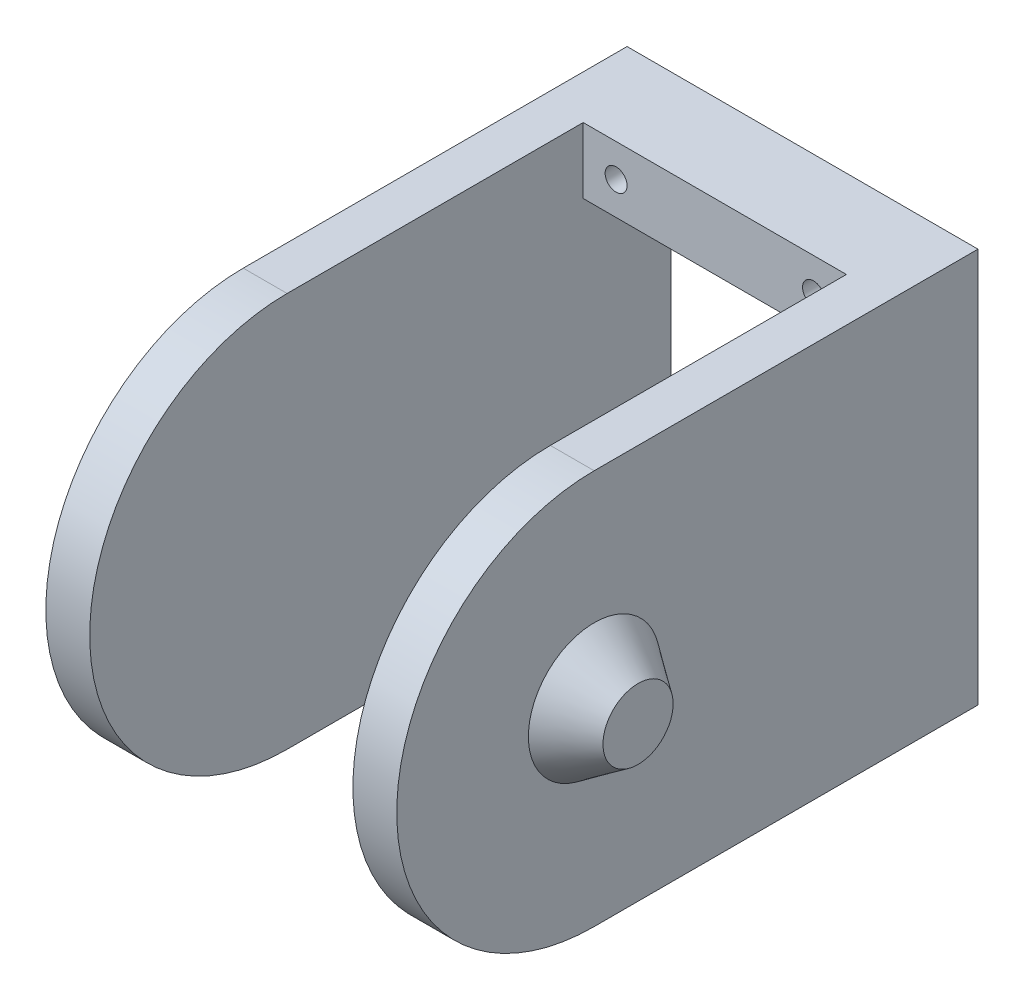
ISO-10303-21;
HEADER;
FILE_DESCRIPTION(('STEP AP214'),'2;1');
FILE_NAME('part.step','',(''),(''),'','','');
FILE_SCHEMA(('AUTOMOTIVE_DESIGN { 1 0 10303 214 1 1 1 1 }'));
ENDSEC;
DATA;
#1=APPLICATION_CONTEXT('core data for automotive mechanical design processes');
#2=APPLICATION_PROTOCOL_DEFINITION('international standard','automotive_design',2000,#1);
#3=PRODUCT_CONTEXT('',#1,'mechanical');
#4=PRODUCT('Part','Part','',(#3));
#5=PRODUCT_RELATED_PRODUCT_CATEGORY('part','',(#4));
#6=PRODUCT_DEFINITION_FORMATION('','',#4);
#7=PRODUCT_DEFINITION_CONTEXT('part definition',#1,'design');
#8=PRODUCT_DEFINITION('design','',#6,#7);
#9=PRODUCT_DEFINITION_SHAPE('','',#8);
#10=(LENGTH_UNIT() NAMED_UNIT(*) SI_UNIT(.MILLI.,.METRE.));
#11=(NAMED_UNIT(*) PLANE_ANGLE_UNIT() SI_UNIT($,.RADIAN.));
#12=(NAMED_UNIT(*) SI_UNIT($,.STERADIAN.) SOLID_ANGLE_UNIT());
#13=UNCERTAINTY_MEASURE_WITH_UNIT(LENGTH_MEASURE(1.E-05),#10,'distance_accuracy_value','');
#14=(GEOMETRIC_REPRESENTATION_CONTEXT(3) GLOBAL_UNCERTAINTY_ASSIGNED_CONTEXT((#13)) GLOBAL_UNIT_ASSIGNED_CONTEXT((#10,
#11,#12)) REPRESENTATION_CONTEXT('',''));
#15=CARTESIAN_POINT('',(0.,0.,0.));
#16=DIRECTION('',(0.,0.,1.));
#17=DIRECTION('',(1.,0.,0.));
#18=AXIS2_PLACEMENT_3D('',#15,#16,#17);
#19=CARTESIAN_POINT('',(0.,0.,2.));
#20=DIRECTION('',(0.,0.,1.));
#21=DIRECTION('',(1.,0.,0.));
#22=AXIS2_PLACEMENT_3D('',#19,#20,#21);
#23=PLANE('',#22);
#24=CARTESIAN_POINT('',(4.5,-7.5,2.));
#25=DIRECTION('',(0.,0.,1.));
#26=DIRECTION('',(-1.,0.,0.));
#27=AXIS2_PLACEMENT_3D('',#24,#25,#26);
#28=CIRCLE('',#27,0.5);
#29=CARTESIAN_POINT('',(4.,-7.5,2.));
#30=VERTEX_POINT('',#29);
#31=EDGE_CURVE('E523',#30,#30,#28,.T.);
#32=ORIENTED_EDGE('',*,*,#31,.F.);
#33=EDGE_LOOP('',(#32));
#34=FACE_BOUND('',#33,.T.);
#35=CARTESIAN_POINT('',(-4.5,-7.5,2.));
#36=DIRECTION('',(0.,0.,-1.));
#37=DIRECTION('',(1.,0.,0.));
#38=AXIS2_PLACEMENT_3D('',#35,#36,#37);
#39=CIRCLE('',#38,0.5);
#40=CARTESIAN_POINT('',(-4.,-7.5,2.));
#41=VERTEX_POINT('',#40);
#42=EDGE_CURVE('E530',#41,#41,#39,.T.);
#43=ORIENTED_EDGE('',*,*,#42,.T.);
#44=EDGE_LOOP('',(#43));
#45=FACE_BOUND('',#44,.T.);
#46=DIRECTION('',(0.,1.,0.));
#47=VECTOR('',#46,1.);
#48=CARTESIAN_POINT('',(-6.,0.,2.));
#49=LINE('',#48,#47);
#50=CARTESIAN_POINT('',(-6.,-9.,2.));
#51=VERTEX_POINT('',#50);
#52=CARTESIAN_POINT('',(-6.,-6.,2.));
#53=VERTEX_POINT('',#52);
#54=EDGE_CURVE('E111',#51,#53,#49,.T.);
#55=ORIENTED_EDGE('',*,*,#54,.F.);
#56=DIRECTION('',(1.,0.,0.));
#57=VECTOR('',#56,1.);
#58=CARTESIAN_POINT('',(0.,-9.,2.));
#59=LINE('',#58,#57);
#60=CARTESIAN_POINT('',(6.,-9.,2.));
#61=VERTEX_POINT('',#60);
#62=EDGE_CURVE('E180',#51,#61,#59,.T.);
#63=ORIENTED_EDGE('',*,*,#62,.T.);
#64=DIRECTION('',(0.,-1.,0.));
#65=VECTOR('',#64,1.);
#66=CARTESIAN_POINT('',(6.,0.,2.));
#67=LINE('',#66,#65);
#68=CARTESIAN_POINT('',(6.,-6.,2.));
#69=VERTEX_POINT('',#68);
#70=EDGE_CURVE('E177',#69,#61,#67,.T.);
#71=ORIENTED_EDGE('',*,*,#70,.F.);
#72=DIRECTION('',(1.,0.,0.));
#73=VECTOR('',#72,1.);
#74=CARTESIAN_POINT('',(-6.,-6.,2.));
#75=LINE('',#74,#73);
#76=EDGE_CURVE('E179',#53,#69,#75,.T.);
#77=ORIENTED_EDGE('',*,*,#76,.F.);
#78=EDGE_LOOP('',(#55,#63,#71,#77));
#79=FACE_BOUND('',#78,.T.);
#80=ADVANCED_FACE('F87',(#34,#45,#79),#23,.T.);
#81=CARTESIAN_POINT('',(4.5,7.5,2.));
#82=DIRECTION('',(0.,0.,-1.));
#83=DIRECTION('',(-1.,0.,0.));
#84=AXIS2_PLACEMENT_3D('',#81,#82,#83);
#85=CIRCLE('',#84,0.5);
#86=CARTESIAN_POINT('',(4.,7.5,2.));
#87=VERTEX_POINT('',#86);
#88=EDGE_CURVE('E537',#87,#87,#85,.T.);
#89=ORIENTED_EDGE('',*,*,#88,.T.);
#90=EDGE_LOOP('',(#89));
#91=FACE_BOUND('',#90,.T.);
#92=CARTESIAN_POINT('',(-4.5,7.5,2.));
#93=DIRECTION('',(0.,0.,1.));
#94=DIRECTION('',(1.,0.,0.));
#95=AXIS2_PLACEMENT_3D('',#92,#93,#94);
#96=CIRCLE('',#95,0.5);
#97=CARTESIAN_POINT('',(-4.,7.5,2.));
#98=VERTEX_POINT('',#97);
#99=EDGE_CURVE('E540',#98,#98,#96,.T.);
#100=ORIENTED_EDGE('',*,*,#99,.F.);
#101=EDGE_LOOP('',(#100));
#102=FACE_BOUND('',#101,.T.);
#103=CARTESIAN_POINT('',(-6.,6.,2.));
#104=VERTEX_POINT('',#103);
#105=CARTESIAN_POINT('',(-6.,9.,2.));
#106=VERTEX_POINT('',#105);
#107=EDGE_CURVE('E227',#104,#106,#49,.T.);
#108=ORIENTED_EDGE('',*,*,#107,.F.);
#109=DIRECTION('',(1.,0.,0.));
#110=VECTOR('',#109,1.);
#111=CARTESIAN_POINT('',(-6.,6.,2.));
#112=LINE('',#111,#110);
#113=CARTESIAN_POINT('',(6.,6.,2.));
#114=VERTEX_POINT('',#113);
#115=EDGE_CURVE('E204',#104,#114,#112,.T.);
#116=ORIENTED_EDGE('',*,*,#115,.T.);
#117=CARTESIAN_POINT('',(6.,9.,2.));
#118=VERTEX_POINT('',#117);
#119=EDGE_CURVE('E184',#118,#114,#67,.T.);
#120=ORIENTED_EDGE('',*,*,#119,.F.);
#121=DIRECTION('',(-1.,0.,0.));
#122=VECTOR('',#121,1.);
#123=CARTESIAN_POINT('',(0.,9.,2.));
#124=LINE('',#123,#122);
#125=EDGE_CURVE('E261',#118,#106,#124,.T.);
#126=ORIENTED_EDGE('',*,*,#125,.T.);
#127=EDGE_LOOP('',(#108,#116,#120,#126));
#128=FACE_BOUND('',#127,.T.);
#129=ADVANCED_FACE('F310',(#91,#102,#128),#23,.T.);
#130=CARTESIAN_POINT('',(0.,0.,-2.));
#131=DIRECTION('',(0.,0.,1.));
#132=DIRECTION('',(1.,0.,0.));
#133=AXIS2_PLACEMENT_3D('',#130,#131,#132);
#134=PLANE('',#133);
#135=CARTESIAN_POINT('',(4.5,-7.5,-2.));
#136=DIRECTION('',(0.,0.,1.));
#137=DIRECTION('',(1.,0.,0.));
#138=AXIS2_PLACEMENT_3D('',#135,#136,#137);
#139=CIRCLE('',#138,0.5);
#140=CARTESIAN_POINT('',(5.,-7.5,-2.));
#141=VERTEX_POINT('',#140);
#142=EDGE_CURVE('E526',#141,#141,#139,.F.);
#143=ORIENTED_EDGE('',*,*,#142,.F.);
#144=EDGE_LOOP('',(#143));
#145=FACE_BOUND('',#144,.T.);
#146=CARTESIAN_POINT('',(-4.5,-7.5,-2.));
#147=DIRECTION('',(0.,0.,1.));
#148=DIRECTION('',(1.,0.,0.));
#149=AXIS2_PLACEMENT_3D('',#146,#147,#148);
#150=CIRCLE('',#149,0.5);
#151=CARTESIAN_POINT('',(-4.,-7.5,-2.));
#152=VERTEX_POINT('',#151);
#153=EDGE_CURVE('E527',#152,#152,#150,.T.);
#154=ORIENTED_EDGE('',*,*,#153,.T.);
#155=EDGE_LOOP('',(#154));
#156=FACE_BOUND('',#155,.T.);
#157=CARTESIAN_POINT('',(4.5,7.5,-2.));
#158=DIRECTION('',(0.,0.,1.));
#159=DIRECTION('',(1.,0.,0.));
#160=AXIS2_PLACEMENT_3D('',#157,#158,#159);
#161=CIRCLE('',#160,0.5);
#162=CARTESIAN_POINT('',(5.,7.5,-2.));
#163=VERTEX_POINT('',#162);
#164=EDGE_CURVE('E535',#163,#163,#161,.T.);
#165=ORIENTED_EDGE('',*,*,#164,.T.);
#166=EDGE_LOOP('',(#165));
#167=FACE_BOUND('',#166,.T.);
#168=CARTESIAN_POINT('',(-4.5,7.5,-2.));
#169=DIRECTION('',(0.,0.,1.));
#170=DIRECTION('',(1.,0.,0.));
#171=AXIS2_PLACEMENT_3D('',#168,#169,#170);
#172=CIRCLE('',#171,0.5);
#173=CARTESIAN_POINT('',(-4.,7.5,-2.));
#174=VERTEX_POINT('',#173);
#175=EDGE_CURVE('E195',#174,#174,#172,.F.);
#176=ORIENTED_EDGE('',*,*,#175,.F.);
#177=EDGE_LOOP('',(#176));
#178=FACE_BOUND('',#177,.T.);
#179=DIRECTION('',(-1.,0.,0.));
#180=VECTOR('',#179,1.);
#181=CARTESIAN_POINT('',(-6.,-6.,-2.));
#182=LINE('',#181,#180);
#183=CARTESIAN_POINT('',(6.,-6.,-2.));
#184=VERTEX_POINT('',#183);
#185=CARTESIAN_POINT('',(-6.,-6.,-2.));
#186=VERTEX_POINT('',#185);
#187=EDGE_CURVE('E201',#184,#186,#182,.T.);
#188=ORIENTED_EDGE('',*,*,#187,.F.);
#189=DIRECTION('',(0.,1.,0.));
#190=VECTOR('',#189,1.);
#191=CARTESIAN_POINT('',(6.,-7.,-2.));
#192=LINE('',#191,#190);
#193=CARTESIAN_POINT('',(6.,6.,-2.));
#194=VERTEX_POINT('',#193);
#195=EDGE_CURVE('E199',#184,#194,#192,.T.);
#196=ORIENTED_EDGE('',*,*,#195,.T.);
#197=DIRECTION('',(-1.,0.,0.));
#198=VECTOR('',#197,1.);
#199=CARTESIAN_POINT('',(-6.,6.,-2.));
#200=LINE('',#199,#198);
#201=CARTESIAN_POINT('',(-6.,6.,-2.));
#202=VERTEX_POINT('',#201);
#203=EDGE_CURVE('E210',#194,#202,#200,.T.);
#204=ORIENTED_EDGE('',*,*,#203,.T.);
#205=DIRECTION('',(0.,-1.,0.));
#206=VECTOR('',#205,1.);
#207=CARTESIAN_POINT('',(-6.,-7.,-2.));
#208=LINE('',#207,#206);
#209=EDGE_CURVE('E257',#202,#186,#208,.T.);
#210=ORIENTED_EDGE('',*,*,#209,.T.);
#211=EDGE_LOOP('',(#188,#196,#204,#210));
#212=FACE_BOUND('',#211,.T.);
#213=DIRECTION('',(0.,1.,0.));
#214=VECTOR('',#213,1.);
#215=CARTESIAN_POINT('',(8.,0.,-2.));
#216=LINE('',#215,#214);
#217=CARTESIAN_POINT('',(8.,-9.,-2.));
#218=VERTEX_POINT('',#217);
#219=CARTESIAN_POINT('',(8.,9.,-2.));
#220=VERTEX_POINT('',#219);
#221=EDGE_CURVE('E260',#218,#220,#216,.T.);
#222=ORIENTED_EDGE('',*,*,#221,.F.);
#223=DIRECTION('',(1.,0.,0.));
#224=VECTOR('',#223,1.);
#225=CARTESIAN_POINT('',(0.,-9.,-2.));
#226=LINE('',#225,#224);
#227=CARTESIAN_POINT('',(-8.,-9.,-2.));
#228=VERTEX_POINT('',#227);
#229=EDGE_CURVE('E263',#228,#218,#226,.T.);
#230=ORIENTED_EDGE('',*,*,#229,.F.);
#231=DIRECTION('',(0.,-1.,0.));
#232=VECTOR('',#231,1.);
#233=CARTESIAN_POINT('',(-8.,0.,-2.));
#234=LINE('',#233,#232);
#235=CARTESIAN_POINT('',(-8.,9.,-2.));
#236=VERTEX_POINT('',#235);
#237=EDGE_CURVE('E270',#236,#228,#234,.T.);
#238=ORIENTED_EDGE('',*,*,#237,.F.);
#239=DIRECTION('',(-1.,0.,0.));
#240=VECTOR('',#239,1.);
#241=CARTESIAN_POINT('',(0.,9.,-2.));
#242=LINE('',#241,#240);
#243=EDGE_CURVE('E268',#220,#236,#242,.T.);
#244=ORIENTED_EDGE('',*,*,#243,.F.);
#245=EDGE_LOOP('',(#222,#230,#238,#244));
#246=FACE_BOUND('',#245,.T.);
#247=ADVANCED_FACE('F290',(#145,#156,#167,#178,#212,#246),#134,.F.);
#248=CARTESIAN_POINT('',(8.,0.,2.));
#249=DIRECTION('',(-1.,0.,0.));
#250=DIRECTION('',(0.,0.,1.));
#251=AXIS2_PLACEMENT_3D('',#248,#249,#250);
#252=PLANE('',#251);
#253=CARTESIAN_POINT('',(8.,0.,15.5));
#254=DIRECTION('',(1.,0.,0.));
#255=DIRECTION('',(0.,0.,-1.));
#256=AXIS2_PLACEMENT_3D('',#253,#254,#255);
#257=CIRCLE('',#256,3.);
#258=CARTESIAN_POINT('',(8.,0.,12.5));
#259=VERTEX_POINT('',#258);
#260=EDGE_CURVE('E12',#259,#259,#257,.T.);
#261=ORIENTED_EDGE('',*,*,#260,.F.);
#262=EDGE_LOOP('',(#261));
#263=FACE_BOUND('',#262,.T.);
#264=DIRECTION('',(0.,0.,-1.));
#265=VECTOR('',#264,1.);
#266=CARTESIAN_POINT('',(8.,-9.,2.));
#267=LINE('',#266,#265);
#268=CARTESIAN_POINT('',(8.,-9.,15.5));
#269=VERTEX_POINT('',#268);
#270=EDGE_CURVE('E265',#269,#218,#267,.T.);
#271=ORIENTED_EDGE('',*,*,#270,.T.);
#272=ORIENTED_EDGE('',*,*,#221,.T.);
#273=DIRECTION('',(0.,0.,-1.));
#274=VECTOR('',#273,1.);
#275=CARTESIAN_POINT('',(8.,9.,2.));
#276=LINE('',#275,#274);
#277=CARTESIAN_POINT('',(8.,9.,15.5));
#278=VERTEX_POINT('',#277);
#279=EDGE_CURVE('E91',#278,#220,#276,.T.);
#280=ORIENTED_EDGE('',*,*,#279,.F.);
#281=CARTESIAN_POINT('',(8.,0.,15.5));
#282=DIRECTION('',(1.,0.,0.));
#283=DIRECTION('',(0.,0.,-1.));
#284=AXIS2_PLACEMENT_3D('',#281,#282,#283);
#285=CIRCLE('',#284,9.);
#286=EDGE_CURVE('E241',#278,#269,#285,.T.);
#287=ORIENTED_EDGE('',*,*,#286,.T.);
#288=EDGE_LOOP('',(#271,#272,#280,#287));
#289=FACE_BOUND('',#288,.T.);
#290=ADVANCED_FACE('F89',(#263,#289),#252,.F.);
#291=CARTESIAN_POINT('',(0.,9.,2.));
#292=DIRECTION('',(0.,-1.,0.));
#293=DIRECTION('',(0.,0.,-1.));
#294=AXIS2_PLACEMENT_3D('',#291,#292,#293);
#295=PLANE('',#294);
#296=ORIENTED_EDGE('',*,*,#243,.T.);
#297=DIRECTION('',(0.,0.,-1.));
#298=VECTOR('',#297,1.);
#299=CARTESIAN_POINT('',(-8.,9.,2.));
#300=LINE('',#299,#298);
#301=CARTESIAN_POINT('',(-8.,9.,15.5));
#302=VERTEX_POINT('',#301);
#303=EDGE_CURVE('E277',#302,#236,#300,.T.);
#304=ORIENTED_EDGE('',*,*,#303,.F.);
#305=DIRECTION('',(-1.,0.,0.));
#306=VECTOR('',#305,1.);
#307=CARTESIAN_POINT('',(38.0351369592827,9.,15.5));
#308=LINE('',#307,#306);
#309=CARTESIAN_POINT('',(-6.,9.,15.5));
#310=VERTEX_POINT('',#309);
#311=EDGE_CURVE('E219',#310,#302,#308,.T.);
#312=ORIENTED_EDGE('',*,*,#311,.F.);
#313=DIRECTION('',(0.,0.,1.));
#314=VECTOR('',#313,1.);
#315=CARTESIAN_POINT('',(-6.,9.,-2.));
#316=LINE('',#315,#314);
#317=EDGE_CURVE('E228',#106,#310,#316,.T.);
#318=ORIENTED_EDGE('',*,*,#317,.F.);
#319=ORIENTED_EDGE('',*,*,#125,.F.);
#320=DIRECTION('',(0.,0.,1.));
#321=VECTOR('',#320,1.);
#322=CARTESIAN_POINT('',(6.,9.,-2.));
#323=LINE('',#322,#321);
#324=CARTESIAN_POINT('',(6.,9.,15.5));
#325=VERTEX_POINT('',#324);
#326=EDGE_CURVE('E244',#118,#325,#323,.T.);
#327=ORIENTED_EDGE('',*,*,#326,.T.);
#328=DIRECTION('',(1.,0.,0.));
#329=VECTOR('',#328,1.);
#330=CARTESIAN_POINT('',(-26.0351369592827,9.,15.5));
#331=LINE('',#330,#329);
#332=EDGE_CURVE('E246',#325,#278,#331,.T.);
#333=ORIENTED_EDGE('',*,*,#332,.T.);
#334=ORIENTED_EDGE('',*,*,#279,.T.);
#335=EDGE_LOOP('',(#296,#304,#312,#318,#319,#327,#333,#334));
#336=FACE_BOUND('',#335,.T.);
#337=ADVANCED_FACE('F284',(#336),#295,.F.);
#338=CARTESIAN_POINT('',(-8.,0.,2.));
#339=DIRECTION('',(1.,0.,0.));
#340=DIRECTION('',(0.,0.,-1.));
#341=AXIS2_PLACEMENT_3D('',#338,#339,#340);
#342=PLANE('',#341);
#343=CARTESIAN_POINT('',(-8.,0.,15.5));
#344=DIRECTION('',(1.,0.,0.));
#345=DIRECTION('',(0.,0.,-1.));
#346=AXIS2_PLACEMENT_3D('',#343,#344,#345);
#347=CIRCLE('',#346,3.);
#348=CARTESIAN_POINT('',(-8.,0.,12.5));
#349=VERTEX_POINT('',#348);
#350=EDGE_CURVE('E213',#349,#349,#347,.T.);
#351=ORIENTED_EDGE('',*,*,#350,.T.);
#352=EDGE_LOOP('',(#351));
#353=FACE_BOUND('',#352,.T.);
#354=ORIENTED_EDGE('',*,*,#237,.T.);
#355=DIRECTION('',(0.,0.,-1.));
#356=VECTOR('',#355,1.);
#357=CARTESIAN_POINT('',(-8.,-9.,2.));
#358=LINE('',#357,#356);
#359=CARTESIAN_POINT('',(-8.,-9.,15.5));
#360=VERTEX_POINT('',#359);
#361=EDGE_CURVE('E275',#360,#228,#358,.T.);
#362=ORIENTED_EDGE('',*,*,#361,.F.);
#363=CARTESIAN_POINT('',(-8.,0.,15.5));
#364=DIRECTION('',(1.,0.,0.));
#365=DIRECTION('',(0.,0.,-1.));
#366=AXIS2_PLACEMENT_3D('',#363,#364,#365);
#367=CIRCLE('',#366,9.);
#368=EDGE_CURVE('E220',#302,#360,#367,.T.);
#369=ORIENTED_EDGE('',*,*,#368,.F.);
#370=ORIENTED_EDGE('',*,*,#303,.T.);
#371=EDGE_LOOP('',(#354,#362,#369,#370));
#372=FACE_BOUND('',#371,.T.);
#373=ADVANCED_FACE('F345',(#353,#372),#342,.F.);
#374=CARTESIAN_POINT('',(0.,-9.,2.));
#375=DIRECTION('',(0.,1.,0.));
#376=DIRECTION('',(0.,0.,1.));
#377=AXIS2_PLACEMENT_3D('',#374,#375,#376);
#378=PLANE('',#377);
#379=ORIENTED_EDGE('',*,*,#62,.F.);
#380=DIRECTION('',(0.,0.,-1.));
#381=VECTOR('',#380,1.);
#382=CARTESIAN_POINT('',(-6.,-9.,-2.));
#383=LINE('',#382,#381);
#384=CARTESIAN_POINT('',(-6.,-9.,15.5));
#385=VERTEX_POINT('',#384);
#386=EDGE_CURVE('E230',#385,#51,#383,.T.);
#387=ORIENTED_EDGE('',*,*,#386,.F.);
#388=DIRECTION('',(-1.,0.,0.));
#389=VECTOR('',#388,1.);
#390=CARTESIAN_POINT('',(38.0351369592827,-9.,15.5));
#391=LINE('',#390,#389);
#392=EDGE_CURVE('E223',#385,#360,#391,.T.);
#393=ORIENTED_EDGE('',*,*,#392,.T.);
#394=ORIENTED_EDGE('',*,*,#361,.T.);
#395=ORIENTED_EDGE('',*,*,#229,.T.);
#396=ORIENTED_EDGE('',*,*,#270,.F.);
#397=DIRECTION('',(1.,0.,0.));
#398=VECTOR('',#397,1.);
#399=CARTESIAN_POINT('',(-26.0351369592827,-9.,15.5));
#400=LINE('',#399,#398);
#401=CARTESIAN_POINT('',(6.,-9.,15.5));
#402=VERTEX_POINT('',#401);
#403=EDGE_CURVE('E248',#402,#269,#400,.T.);
#404=ORIENTED_EDGE('',*,*,#403,.F.);
#405=DIRECTION('',(0.,0.,-1.));
#406=VECTOR('',#405,1.);
#407=CARTESIAN_POINT('',(6.,-9.,-2.));
#408=LINE('',#407,#406);
#409=EDGE_CURVE('E185',#402,#61,#408,.T.);
#410=ORIENTED_EDGE('',*,*,#409,.T.);
#411=EDGE_LOOP('',(#379,#387,#393,#394,#395,#396,#404,#410));
#412=FACE_BOUND('',#411,.T.);
#413=ADVANCED_FACE('F294',(#412),#378,.F.);
#414=CARTESIAN_POINT('',(6.,-7.,2.));
#415=DIRECTION('',(-1.,0.,0.));
#416=DIRECTION('',(0.,0.,1.));
#417=AXIS2_PLACEMENT_3D('',#414,#415,#416);
#418=PLANE('',#417);
#419=DIRECTION('',(0.,0.,1.));
#420=VECTOR('',#419,1.);
#421=CARTESIAN_POINT('',(6.,-6.,-14.0415945787923));
#422=LINE('',#421,#420);
#423=EDGE_CURVE('E191',#184,#69,#422,.T.);
#424=ORIENTED_EDGE('',*,*,#423,.T.);
#425=ORIENTED_EDGE('',*,*,#70,.T.);
#426=ORIENTED_EDGE('',*,*,#409,.F.);
#427=CARTESIAN_POINT('',(6.,0.,15.5));
#428=DIRECTION('',(-1.,0.,0.));
#429=DIRECTION('',(0.,0.,1.));
#430=AXIS2_PLACEMENT_3D('',#427,#428,#429);
#431=CIRCLE('',#430,9.);
#432=EDGE_CURVE('E249',#325,#402,#431,.F.);
#433=ORIENTED_EDGE('',*,*,#432,.F.);
#434=ORIENTED_EDGE('',*,*,#326,.F.);
#435=ORIENTED_EDGE('',*,*,#119,.T.);
#436=DIRECTION('',(0.,0.,1.));
#437=VECTOR('',#436,1.);
#438=CARTESIAN_POINT('',(6.,6.,-14.0415945787923));
#439=LINE('',#438,#437);
#440=EDGE_CURVE('E207',#194,#114,#439,.T.);
#441=ORIENTED_EDGE('',*,*,#440,.F.);
#442=ORIENTED_EDGE('',*,*,#195,.F.);
#443=EDGE_LOOP('',(#424,#425,#426,#433,#434,#435,#441,#442));
#444=FACE_BOUND('',#443,.T.);
#445=ADVANCED_FACE('F197',(#444),#418,.T.);
#446=CARTESIAN_POINT('',(-6.,-7.,2.));
#447=DIRECTION('',(1.,0.,0.));
#448=DIRECTION('',(0.,0.,-1.));
#449=AXIS2_PLACEMENT_3D('',#446,#447,#448);
#450=PLANE('',#449);
#451=ORIENTED_EDGE('',*,*,#54,.T.);
#452=DIRECTION('',(0.,0.,1.));
#453=VECTOR('',#452,1.);
#454=CARTESIAN_POINT('',(-6.,-6.,-14.0415945787923));
#455=LINE('',#454,#453);
#456=EDGE_CURVE('E194',#186,#53,#455,.T.);
#457=ORIENTED_EDGE('',*,*,#456,.F.);
#458=ORIENTED_EDGE('',*,*,#209,.F.);
#459=DIRECTION('',(0.,0.,1.));
#460=VECTOR('',#459,1.);
#461=CARTESIAN_POINT('',(-6.,6.,-14.0415945787923));
#462=LINE('',#461,#460);
#463=EDGE_CURVE('E103',#202,#104,#462,.T.);
#464=ORIENTED_EDGE('',*,*,#463,.T.);
#465=ORIENTED_EDGE('',*,*,#107,.T.);
#466=ORIENTED_EDGE('',*,*,#317,.T.);
#467=CARTESIAN_POINT('',(-6.,0.,15.5));
#468=DIRECTION('',(1.,0.,0.));
#469=DIRECTION('',(0.,0.,-1.));
#470=AXIS2_PLACEMENT_3D('',#467,#468,#469);
#471=CIRCLE('',#470,9.);
#472=EDGE_CURVE('E224',#310,#385,#471,.T.);
#473=ORIENTED_EDGE('',*,*,#472,.T.);
#474=ORIENTED_EDGE('',*,*,#386,.T.);
#475=EDGE_LOOP('',(#451,#457,#458,#464,#465,#466,#473,#474));
#476=FACE_BOUND('',#475,.T.);
#477=ADVANCED_FACE('F301',(#476),#450,.T.);
#478=CARTESIAN_POINT('',(-26.0351369592827,0.,15.5));
#479=DIRECTION('',(1.,0.,0.));
#480=DIRECTION('',(0.,0.,-1.));
#481=AXIS2_PLACEMENT_3D('',#478,#479,#480);
#482=CYLINDRICAL_SURFACE('',#481,9.);
#483=ORIENTED_EDGE('',*,*,#332,.F.);
#484=ORIENTED_EDGE('',*,*,#432,.T.);
#485=ORIENTED_EDGE('',*,*,#403,.T.);
#486=ORIENTED_EDGE('',*,*,#286,.F.);
#487=EDGE_LOOP('',(#483,#484,#485,#486));
#488=FACE_BOUND('',#487,.T.);
#489=ADVANCED_FACE('F296',(#488),#482,.T.);
#490=CARTESIAN_POINT('',(8.,0.,15.5));
#491=DIRECTION('',(-1.,0.,0.));
#492=DIRECTION('',(0.,0.,-1.));
#493=AXIS2_PLACEMENT_3D('',#490,#491,#492);
#494=CONICAL_SURFACE('',#493,3.,0.610865238198016);
#495=CARTESIAN_POINT('',(10.,0.,15.5));
#496=DIRECTION('',(1.,0.,0.));
#497=DIRECTION('',(0.,0.,-1.));
#498=AXIS2_PLACEMENT_3D('',#495,#496,#497);
#499=CIRCLE('',#498,1.59958492358058);
#500=CARTESIAN_POINT('',(10.,0.,13.9004150764194));
#501=VERTEX_POINT('',#500);
#502=EDGE_CURVE('E237',#501,#501,#499,.T.);
#503=ORIENTED_EDGE('',*,*,#502,.F.);
#504=EDGE_LOOP('',(#503));
#505=FACE_BOUND('',#504,.T.);
#506=ORIENTED_EDGE('',*,*,#260,.T.);
#507=EDGE_LOOP('',(#506));
#508=FACE_BOUND('',#507,.T.);
#509=ADVANCED_FACE('F358',(#505,#508),#494,.T.);
#510=CARTESIAN_POINT('',(10.,0.,15.5));
#511=DIRECTION('',(1.,0.,0.));
#512=DIRECTION('',(0.,0.,-1.));
#513=AXIS2_PLACEMENT_3D('',#510,#511,#512);
#514=PLANE('',#513);
#515=ORIENTED_EDGE('',*,*,#502,.T.);
#516=EDGE_LOOP('',(#515));
#517=FACE_BOUND('',#516,.T.);
#518=ADVANCED_FACE('F360',(#517),#514,.T.);
#519=CARTESIAN_POINT('',(38.0351369592827,0.,15.5));
#520=DIRECTION('',(-1.,0.,0.));
#521=DIRECTION('',(0.,0.,1.));
#522=AXIS2_PLACEMENT_3D('',#519,#520,#521);
#523=CYLINDRICAL_SURFACE('',#522,9.);
#524=ORIENTED_EDGE('',*,*,#472,.F.);
#525=ORIENTED_EDGE('',*,*,#311,.T.);
#526=ORIENTED_EDGE('',*,*,#368,.T.);
#527=ORIENTED_EDGE('',*,*,#392,.F.);
#528=EDGE_LOOP('',(#524,#525,#526,#527));
#529=FACE_BOUND('',#528,.T.);
#530=ADVANCED_FACE('F307',(#529),#523,.T.);
#531=CARTESIAN_POINT('',(-8.,0.,15.5));
#532=DIRECTION('',(1.,0.,0.));
#533=DIRECTION('',(0.,0.,-1.));
#534=AXIS2_PLACEMENT_3D('',#531,#532,#533);
#535=CONICAL_SURFACE('',#534,3.,0.610865238198016);
#536=CARTESIAN_POINT('',(-10.,0.,15.5));
#537=DIRECTION('',(-1.,0.,0.));
#538=DIRECTION('',(0.,0.,1.));
#539=AXIS2_PLACEMENT_3D('',#536,#537,#538);
#540=CIRCLE('',#539,1.59958492358058);
#541=CARTESIAN_POINT('',(-10.,0.,17.0995849235806));
#542=VERTEX_POINT('',#541);
#543=EDGE_CURVE('E216',#542,#542,#540,.F.);
#544=ORIENTED_EDGE('',*,*,#543,.T.);
#545=EDGE_LOOP('',(#544));
#546=FACE_BOUND('',#545,.T.);
#547=ORIENTED_EDGE('',*,*,#350,.F.);
#548=EDGE_LOOP('',(#547));
#549=FACE_BOUND('',#548,.T.);
#550=ADVANCED_FACE('F324',(#546,#549),#535,.T.);
#551=CARTESIAN_POINT('',(-10.,0.,15.5));
#552=DIRECTION('',(-1.,0.,0.));
#553=DIRECTION('',(0.,0.,-1.));
#554=AXIS2_PLACEMENT_3D('',#551,#552,#553);
#555=PLANE('',#554);
#556=ORIENTED_EDGE('',*,*,#543,.F.);
#557=EDGE_LOOP('',(#556));
#558=FACE_BOUND('',#557,.T.);
#559=ADVANCED_FACE('F315',(#558),#555,.T.);
#560=CARTESIAN_POINT('',(-6.,6.,-14.0415945787923));
#561=DIRECTION('',(0.,-1.,0.));
#562=DIRECTION('',(0.,0.,-1.));
#563=AXIS2_PLACEMENT_3D('',#560,#561,#562);
#564=PLANE('',#563);
#565=ORIENTED_EDGE('',*,*,#203,.F.);
#566=ORIENTED_EDGE('',*,*,#440,.T.);
#567=ORIENTED_EDGE('',*,*,#115,.F.);
#568=ORIENTED_EDGE('',*,*,#463,.F.);
#569=EDGE_LOOP('',(#565,#566,#567,#568));
#570=FACE_BOUND('',#569,.T.);
#571=ADVANCED_FACE('F313',(#570),#564,.T.);
#572=CARTESIAN_POINT('',(-6.,-6.,-14.0415945787923));
#573=DIRECTION('',(0.,-1.,0.));
#574=DIRECTION('',(0.,0.,-1.));
#575=AXIS2_PLACEMENT_3D('',#572,#573,#574);
#576=PLANE('',#575);
#577=ORIENTED_EDGE('',*,*,#423,.F.);
#578=ORIENTED_EDGE('',*,*,#187,.T.);
#579=ORIENTED_EDGE('',*,*,#456,.T.);
#580=ORIENTED_EDGE('',*,*,#76,.T.);
#581=EDGE_LOOP('',(#577,#578,#579,#580));
#582=FACE_BOUND('',#581,.T.);
#583=ADVANCED_FACE('F190',(#582),#576,.F.);
#584=CARTESIAN_POINT('',(-4.5,7.5,-2.001));
#585=DIRECTION('',(0.,0.,1.));
#586=DIRECTION('',(1.,0.,0.));
#587=AXIS2_PLACEMENT_3D('',#584,#585,#586);
#588=CYLINDRICAL_SURFACE('',#587,0.5);
#589=ORIENTED_EDGE('',*,*,#99,.T.);
#590=EDGE_LOOP('',(#589));
#591=FACE_BOUND('',#590,.T.);
#592=ORIENTED_EDGE('',*,*,#175,.T.);
#593=EDGE_LOOP('',(#592));
#594=FACE_BOUND('',#593,.T.);
#595=ADVANCED_FACE('F322',(#591,#594),#588,.F.);
#596=CARTESIAN_POINT('',(4.5,7.5,-2.001));
#597=DIRECTION('',(0.,0.,1.));
#598=DIRECTION('',(1.,0.,0.));
#599=AXIS2_PLACEMENT_3D('',#596,#597,#598);
#600=CYLINDRICAL_SURFACE('',#599,0.5);
#601=ORIENTED_EDGE('',*,*,#88,.F.);
#602=EDGE_LOOP('',(#601));
#603=FACE_BOUND('',#602,.T.);
#604=ORIENTED_EDGE('',*,*,#164,.F.);
#605=EDGE_LOOP('',(#604));
#606=FACE_BOUND('',#605,.T.);
#607=ADVANCED_FACE('F487',(#603,#606),#600,.F.);
#608=CARTESIAN_POINT('',(-4.5,-7.5,-2.001));
#609=DIRECTION('',(0.,0.,1.));
#610=DIRECTION('',(1.,0.,0.));
#611=AXIS2_PLACEMENT_3D('',#608,#609,#610);
#612=CYLINDRICAL_SURFACE('',#611,0.5);
#613=ORIENTED_EDGE('',*,*,#42,.F.);
#614=EDGE_LOOP('',(#613));
#615=FACE_BOUND('',#614,.T.);
#616=ORIENTED_EDGE('',*,*,#153,.F.);
#617=EDGE_LOOP('',(#616));
#618=FACE_BOUND('',#617,.T.);
#619=ADVANCED_FACE('F496',(#615,#618),#612,.F.);
#620=CARTESIAN_POINT('',(4.5,-7.5,-2.001));
#621=DIRECTION('',(0.,0.,1.));
#622=DIRECTION('',(1.,0.,0.));
#623=AXIS2_PLACEMENT_3D('',#620,#621,#622);
#624=CYLINDRICAL_SURFACE('',#623,0.5);
#625=ORIENTED_EDGE('',*,*,#31,.T.);
#626=EDGE_LOOP('',(#625));
#627=FACE_BOUND('',#626,.T.);
#628=ORIENTED_EDGE('',*,*,#142,.T.);
#629=EDGE_LOOP('',(#628));
#630=FACE_BOUND('',#629,.T.);
#631=ADVANCED_FACE('F505',(#627,#630),#624,.F.);
#632=CLOSED_SHELL('',(#80,#129,#247,#290,#337,#373,#413,#445,#477,#489,#509,#518,#530,#550,#559,
#571,#583,#595,#607,#619,#631));
#633=MANIFOLD_SOLID_BREP('B2',#632);
#634=ADVANCED_BREP_SHAPE_REPRESENTATION('',(#18,#633),#14);
#635=SHAPE_DEFINITION_REPRESENTATION(#9,#634);
ENDSEC;
END-ISO-10303-21;
